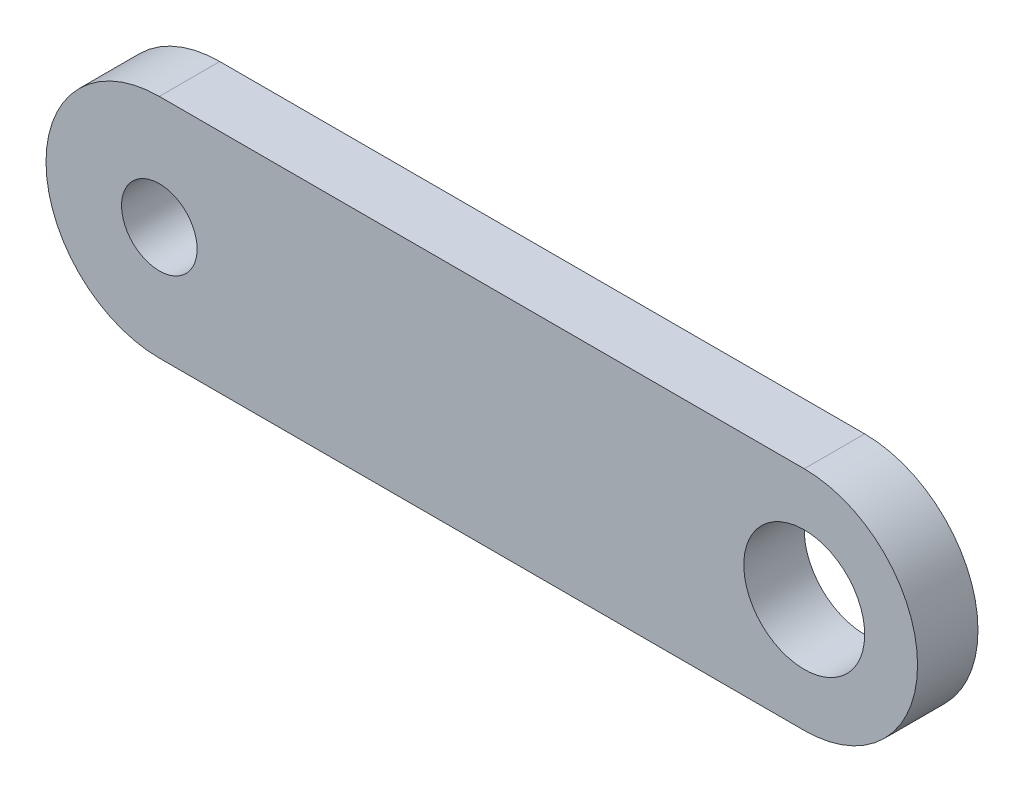
ISO-10303-21;
HEADER;
FILE_DESCRIPTION(('STEP AP214'),'2;1');
FILE_NAME('part.step','',(''),(''),'','','');
FILE_SCHEMA(('AUTOMOTIVE_DESIGN { 1 0 10303 214 1 1 1 1 }'));
ENDSEC;
DATA;
#1=APPLICATION_CONTEXT('core data for automotive mechanical design processes');
#2=APPLICATION_PROTOCOL_DEFINITION('international standard','automotive_design',2000,#1);
#3=PRODUCT_CONTEXT('',#1,'mechanical');
#4=PRODUCT('Part','Part','',(#3));
#5=PRODUCT_RELATED_PRODUCT_CATEGORY('part','',(#4));
#6=PRODUCT_DEFINITION_FORMATION('','',#4);
#7=PRODUCT_DEFINITION_CONTEXT('part definition',#1,'design');
#8=PRODUCT_DEFINITION('design','',#6,#7);
#9=PRODUCT_DEFINITION_SHAPE('','',#8);
#10=(LENGTH_UNIT() NAMED_UNIT(*) SI_UNIT(.MILLI.,.METRE.));
#11=(NAMED_UNIT(*) PLANE_ANGLE_UNIT() SI_UNIT($,.RADIAN.));
#12=(NAMED_UNIT(*) SI_UNIT($,.STERADIAN.) SOLID_ANGLE_UNIT());
#13=UNCERTAINTY_MEASURE_WITH_UNIT(LENGTH_MEASURE(1.E-05),#10,'distance_accuracy_value','');
#14=(GEOMETRIC_REPRESENTATION_CONTEXT(3) GLOBAL_UNCERTAINTY_ASSIGNED_CONTEXT((#13)) GLOBAL_UNIT_ASSIGNED_CONTEXT((#10,
#11,#12)) REPRESENTATION_CONTEXT('',''));
#15=CARTESIAN_POINT('',(0.,0.,0.));
#16=DIRECTION('',(0.,0.,1.));
#17=DIRECTION('',(1.,0.,0.));
#18=AXIS2_PLACEMENT_3D('',#15,#16,#17);
#19=CARTESIAN_POINT('',(0.,0.,2.54));
#20=DIRECTION('',(0.,0.,-1.));
#21=DIRECTION('',(-1.,0.,0.));
#22=AXIS2_PLACEMENT_3D('',#19,#20,#21);
#23=CYLINDRICAL_SURFACE('',#22,4.7625);
#24=CARTESIAN_POINT('',(0.,0.,0.));
#25=DIRECTION('',(0.,0.,1.));
#26=DIRECTION('',(1.,0.,0.));
#27=AXIS2_PLACEMENT_3D('',#24,#25,#26);
#28=CIRCLE('',#27,4.7625);
#29=CARTESIAN_POINT('',(0.,4.7625,0.));
#30=VERTEX_POINT('',#29);
#31=CARTESIAN_POINT('',(0.,-4.7625,0.));
#32=VERTEX_POINT('',#31);
#33=EDGE_CURVE('E119',#30,#32,#28,.T.);
#34=ORIENTED_EDGE('',*,*,#33,.T.);
#35=DIRECTION('',(0.,0.,-1.));
#36=VECTOR('',#35,1.);
#37=CARTESIAN_POINT('',(0.,-4.7625,2.54));
#38=LINE('',#37,#36);
#39=CARTESIAN_POINT('',(0.,-4.7625,2.54));
#40=VERTEX_POINT('',#39);
#41=EDGE_CURVE('E11',#40,#32,#38,.T.);
#42=ORIENTED_EDGE('',*,*,#41,.F.);
#43=CARTESIAN_POINT('',(0.,0.,2.54));
#44=DIRECTION('',(0.,0.,1.));
#45=DIRECTION('',(1.,0.,0.));
#46=AXIS2_PLACEMENT_3D('',#43,#44,#45);
#47=CIRCLE('',#46,4.7625);
#48=CARTESIAN_POINT('',(0.,4.7625,2.54));
#49=VERTEX_POINT('',#48);
#50=EDGE_CURVE('E93',#49,#40,#47,.T.);
#51=ORIENTED_EDGE('',*,*,#50,.F.);
#52=DIRECTION('',(0.,0.,-1.));
#53=VECTOR('',#52,1.);
#54=CARTESIAN_POINT('',(0.,4.7625,2.54));
#55=LINE('',#54,#53);
#56=EDGE_CURVE('E59',#49,#30,#55,.T.);
#57=ORIENTED_EDGE('',*,*,#56,.T.);
#58=EDGE_LOOP('',(#34,#42,#51,#57));
#59=FACE_BOUND('',#58,.T.);
#60=ADVANCED_FACE('F41',(#59),#23,.T.);
#61=CARTESIAN_POINT('',(0.,-4.7625,2.54));
#62=DIRECTION('',(0.,1.,0.));
#63=DIRECTION('',(0.,0.,1.));
#64=AXIS2_PLACEMENT_3D('',#61,#62,#63);
#65=PLANE('',#64);
#66=DIRECTION('',(1.,0.,0.));
#67=VECTOR('',#66,1.);
#68=CARTESIAN_POINT('',(0.,-4.7625,0.));
#69=LINE('',#68,#67);
#70=CARTESIAN_POINT('',(27.1018,-4.7625,0.));
#71=VERTEX_POINT('',#70);
#72=EDGE_CURVE('E99',#32,#71,#69,.T.);
#73=ORIENTED_EDGE('',*,*,#72,.T.);
#74=DIRECTION('',(0.,0.,-1.));
#75=VECTOR('',#74,1.);
#76=CARTESIAN_POINT('',(27.1018,-4.7625,2.54));
#77=LINE('',#76,#75);
#78=CARTESIAN_POINT('',(27.1018,-4.7625,2.54));
#79=VERTEX_POINT('',#78);
#80=EDGE_CURVE('E51',#79,#71,#77,.T.);
#81=ORIENTED_EDGE('',*,*,#80,.F.);
#82=DIRECTION('',(1.,0.,0.));
#83=VECTOR('',#82,1.);
#84=CARTESIAN_POINT('',(0.,-4.7625,2.54));
#85=LINE('',#84,#83);
#86=EDGE_CURVE('E85',#40,#79,#85,.T.);
#87=ORIENTED_EDGE('',*,*,#86,.F.);
#88=ORIENTED_EDGE('',*,*,#41,.T.);
#89=EDGE_LOOP('',(#73,#81,#87,#88));
#90=FACE_BOUND('',#89,.T.);
#91=ADVANCED_FACE('F98',(#90),#65,.F.);
#92=CARTESIAN_POINT('',(27.1018,0.,2.54));
#93=DIRECTION('',(0.,0.,-1.));
#94=DIRECTION('',(-1.,0.,0.));
#95=AXIS2_PLACEMENT_3D('',#92,#93,#94);
#96=CYLINDRICAL_SURFACE('',#95,4.7625);
#97=CARTESIAN_POINT('',(27.1018,0.,0.));
#98=DIRECTION('',(0.,0.,1.));
#99=DIRECTION('',(1.,0.,0.));
#100=AXIS2_PLACEMENT_3D('',#97,#98,#99);
#101=CIRCLE('',#100,4.7625);
#102=CARTESIAN_POINT('',(27.1018,4.7625,0.));
#103=VERTEX_POINT('',#102);
#104=EDGE_CURVE('E124',#71,#103,#101,.T.);
#105=ORIENTED_EDGE('',*,*,#104,.T.);
#106=DIRECTION('',(0.,0.,-1.));
#107=VECTOR('',#106,1.);
#108=CARTESIAN_POINT('',(27.1018,4.7625,2.54));
#109=LINE('',#108,#107);
#110=CARTESIAN_POINT('',(27.1018,4.7625,2.54));
#111=VERTEX_POINT('',#110);
#112=EDGE_CURVE('E74',#111,#103,#109,.T.);
#113=ORIENTED_EDGE('',*,*,#112,.F.);
#114=CARTESIAN_POINT('',(27.1018,0.,2.54));
#115=DIRECTION('',(0.,0.,1.));
#116=DIRECTION('',(1.,0.,0.));
#117=AXIS2_PLACEMENT_3D('',#114,#115,#116);
#118=CIRCLE('',#117,4.7625);
#119=EDGE_CURVE('E92',#79,#111,#118,.T.);
#120=ORIENTED_EDGE('',*,*,#119,.F.);
#121=ORIENTED_EDGE('',*,*,#80,.T.);
#122=EDGE_LOOP('',(#105,#113,#120,#121));
#123=FACE_BOUND('',#122,.T.);
#124=ADVANCED_FACE('F103',(#123),#96,.T.);
#125=CARTESIAN_POINT('',(0.,4.7625,2.54));
#126=DIRECTION('',(0.,1.,0.));
#127=DIRECTION('',(0.,0.,1.));
#128=AXIS2_PLACEMENT_3D('',#125,#126,#127);
#129=PLANE('',#128);
#130=DIRECTION('',(1.,0.,0.));
#131=VECTOR('',#130,1.);
#132=CARTESIAN_POINT('',(0.,4.7625,0.));
#133=LINE('',#132,#131);
#134=EDGE_CURVE('E127',#30,#103,#133,.T.);
#135=ORIENTED_EDGE('',*,*,#134,.F.);
#136=ORIENTED_EDGE('',*,*,#56,.F.);
#137=DIRECTION('',(1.,0.,0.));
#138=VECTOR('',#137,1.);
#139=CARTESIAN_POINT('',(0.,4.7625,2.54));
#140=LINE('',#139,#138);
#141=EDGE_CURVE('E105',#49,#111,#140,.T.);
#142=ORIENTED_EDGE('',*,*,#141,.T.);
#143=ORIENTED_EDGE('',*,*,#112,.T.);
#144=EDGE_LOOP('',(#135,#136,#142,#143));
#145=FACE_BOUND('',#144,.T.);
#146=ADVANCED_FACE('F169',(#145),#129,.T.);
#147=CARTESIAN_POINT('',(0.,0.,2.54));
#148=DIRECTION('',(0.,0.,-1.));
#149=DIRECTION('',(-1.,0.,0.));
#150=AXIS2_PLACEMENT_3D('',#147,#148,#149);
#151=CYLINDRICAL_SURFACE('',#150,1.5875);
#152=CARTESIAN_POINT('',(0.,0.,2.54));
#153=DIRECTION('',(0.,0.,1.));
#154=DIRECTION('',(1.,0.,0.));
#155=AXIS2_PLACEMENT_3D('',#152,#153,#154);
#156=CIRCLE('',#155,1.5875);
#157=CARTESIAN_POINT('',(1.5875,0.,2.54));
#158=VERTEX_POINT('',#157);
#159=EDGE_CURVE('E135',#158,#158,#156,.T.);
#160=ORIENTED_EDGE('',*,*,#159,.T.);
#161=EDGE_LOOP('',(#160));
#162=FACE_BOUND('',#161,.T.);
#163=CARTESIAN_POINT('',(0.,0.,0.));
#164=DIRECTION('',(0.,0.,1.));
#165=DIRECTION('',(1.,0.,0.));
#166=AXIS2_PLACEMENT_3D('',#163,#164,#165);
#167=CIRCLE('',#166,1.5875);
#168=CARTESIAN_POINT('',(1.5875,0.,0.));
#169=VERTEX_POINT('',#168);
#170=EDGE_CURVE('E115',#169,#169,#167,.T.);
#171=ORIENTED_EDGE('',*,*,#170,.F.);
#172=EDGE_LOOP('',(#171));
#173=FACE_BOUND('',#172,.T.);
#174=ADVANCED_FACE('F43',(#162,#173),#151,.F.);
#175=CARTESIAN_POINT('',(27.1018,0.,2.54));
#176=DIRECTION('',(0.,0.,-1.));
#177=DIRECTION('',(-1.,0.,0.));
#178=AXIS2_PLACEMENT_3D('',#175,#176,#177);
#179=CYLINDRICAL_SURFACE('',#178,2.54);
#180=CARTESIAN_POINT('',(27.1018,0.,2.54));
#181=DIRECTION('',(0.,0.,1.));
#182=DIRECTION('',(1.,0.,0.));
#183=AXIS2_PLACEMENT_3D('',#180,#181,#182);
#184=CIRCLE('',#183,2.54);
#185=CARTESIAN_POINT('',(29.6418,0.,2.54));
#186=VERTEX_POINT('',#185);
#187=EDGE_CURVE('E108',#186,#186,#184,.T.);
#188=ORIENTED_EDGE('',*,*,#187,.T.);
#189=EDGE_LOOP('',(#188));
#190=FACE_BOUND('',#189,.T.);
#191=CARTESIAN_POINT('',(27.1018,0.,0.));
#192=DIRECTION('',(0.,0.,1.));
#193=DIRECTION('',(1.,0.,0.));
#194=AXIS2_PLACEMENT_3D('',#191,#192,#193);
#195=CIRCLE('',#194,2.54);
#196=CARTESIAN_POINT('',(29.6418,0.,0.));
#197=VERTEX_POINT('',#196);
#198=EDGE_CURVE('E131',#197,#197,#195,.T.);
#199=ORIENTED_EDGE('',*,*,#198,.F.);
#200=EDGE_LOOP('',(#199));
#201=FACE_BOUND('',#200,.T.);
#202=ADVANCED_FACE('F151',(#190,#201),#179,.F.);
#203=CARTESIAN_POINT('',(0.,0.,2.54));
#204=DIRECTION('',(0.,0.,1.));
#205=DIRECTION('',(1.,0.,0.));
#206=AXIS2_PLACEMENT_3D('',#203,#204,#205);
#207=PLANE('',#206);
#208=ORIENTED_EDGE('',*,*,#159,.F.);
#209=EDGE_LOOP('',(#208));
#210=FACE_BOUND('',#209,.T.);
#211=ORIENTED_EDGE('',*,*,#50,.T.);
#212=ORIENTED_EDGE('',*,*,#86,.T.);
#213=ORIENTED_EDGE('',*,*,#119,.T.);
#214=ORIENTED_EDGE('',*,*,#141,.F.);
#215=EDGE_LOOP('',(#211,#212,#213,#214));
#216=FACE_BOUND('',#215,.T.);
#217=ORIENTED_EDGE('',*,*,#187,.F.);
#218=EDGE_LOOP('',(#217));
#219=FACE_BOUND('',#218,.T.);
#220=ADVANCED_FACE('F88',(#210,#216,#219),#207,.T.);
#221=CARTESIAN_POINT('',(0.,0.,0.));
#222=DIRECTION('',(0.,0.,1.));
#223=DIRECTION('',(1.,0.,0.));
#224=AXIS2_PLACEMENT_3D('',#221,#222,#223);
#225=PLANE('',#224);
#226=ORIENTED_EDGE('',*,*,#170,.T.);
#227=EDGE_LOOP('',(#226));
#228=FACE_BOUND('',#227,.T.);
#229=ORIENTED_EDGE('',*,*,#33,.F.);
#230=ORIENTED_EDGE('',*,*,#134,.T.);
#231=ORIENTED_EDGE('',*,*,#104,.F.);
#232=ORIENTED_EDGE('',*,*,#72,.F.);
#233=EDGE_LOOP('',(#229,#230,#231,#232));
#234=FACE_BOUND('',#233,.T.);
#235=ORIENTED_EDGE('',*,*,#198,.T.);
#236=EDGE_LOOP('',(#235));
#237=FACE_BOUND('',#236,.T.);
#238=ADVANCED_FACE('F150',(#228,#234,#237),#225,.F.);
#239=CLOSED_SHELL('',(#60,#91,#124,#146,#174,#202,#220,#238));
#240=MANIFOLD_SOLID_BREP('B2',#239);
#241=ADVANCED_BREP_SHAPE_REPRESENTATION('',(#18,#240),#14);
#242=SHAPE_DEFINITION_REPRESENTATION(#9,#241);
ENDSEC;
END-ISO-10303-21;
